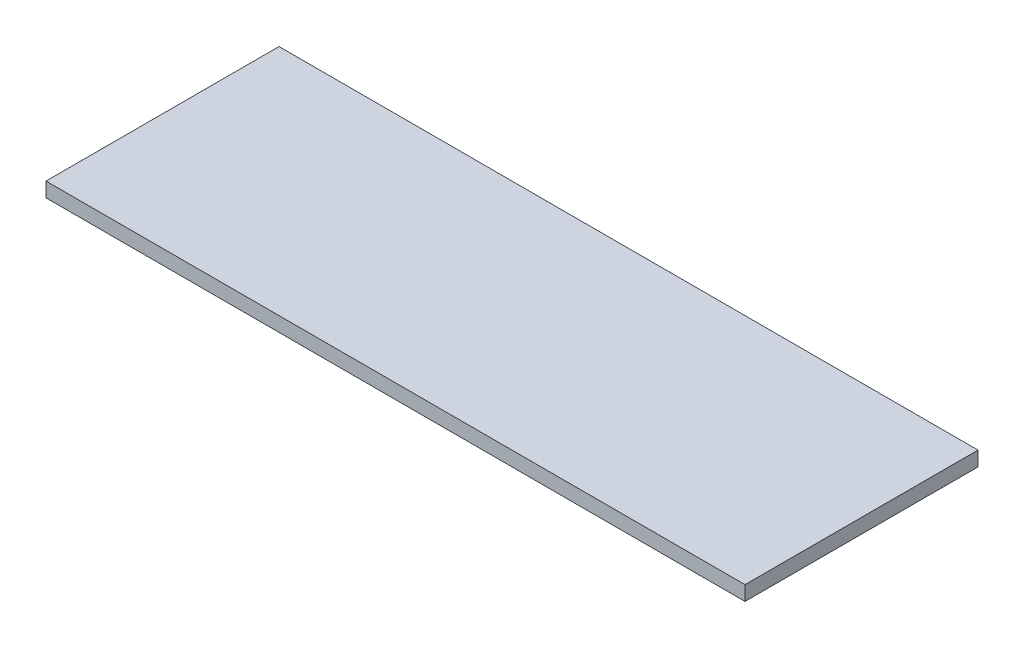
ISO-10303-21;
HEADER;
FILE_DESCRIPTION(('STEP AP214'),'2;1');
FILE_NAME('part.step','',(''),(''),'','','');
FILE_SCHEMA(('AUTOMOTIVE_DESIGN { 1 0 10303 214 1 1 1 1 }'));
ENDSEC;
DATA;
#1=APPLICATION_CONTEXT('core data for automotive mechanical design processes');
#2=APPLICATION_PROTOCOL_DEFINITION('international standard','automotive_design',2000,#1);
#3=PRODUCT_CONTEXT('',#1,'mechanical');
#4=PRODUCT('Part','Part','',(#3));
#5=PRODUCT_RELATED_PRODUCT_CATEGORY('part','',(#4));
#6=PRODUCT_DEFINITION_FORMATION('','',#4);
#7=PRODUCT_DEFINITION_CONTEXT('part definition',#1,'design');
#8=PRODUCT_DEFINITION('design','',#6,#7);
#9=PRODUCT_DEFINITION_SHAPE('','',#8);
#10=(LENGTH_UNIT() NAMED_UNIT(*) SI_UNIT(.MILLI.,.METRE.));
#11=(NAMED_UNIT(*) PLANE_ANGLE_UNIT() SI_UNIT($,.RADIAN.));
#12=(NAMED_UNIT(*) SI_UNIT($,.STERADIAN.) SOLID_ANGLE_UNIT());
#13=UNCERTAINTY_MEASURE_WITH_UNIT(LENGTH_MEASURE(1.E-05),#10,'distance_accuracy_value','');
#14=(GEOMETRIC_REPRESENTATION_CONTEXT(3) GLOBAL_UNCERTAINTY_ASSIGNED_CONTEXT((#13)) GLOBAL_UNIT_ASSIGNED_CONTEXT((#10,
#11,#12)) REPRESENTATION_CONTEXT('',''));
#15=CARTESIAN_POINT('',(0.,0.,0.));
#16=DIRECTION('',(0.,0.,1.));
#17=DIRECTION('',(1.,0.,0.));
#18=AXIS2_PLACEMENT_3D('',#15,#16,#17);
#19=CARTESIAN_POINT('',(19.6888888888889,7.35555555555552,8.25));
#20=DIRECTION('',(1.,0.,0.));
#21=DIRECTION('',(0.,0.,1.));
#22=AXIS2_PLACEMENT_3D('',#19,#20,#21);
#23=PLANE('',#22);
#24=DIRECTION('',(0.,0.,-1.));
#25=VECTOR('',#24,1.);
#26=CARTESIAN_POINT('',(19.6888888888889,8.35555555555552,8.25));
#27=LINE('',#26,#25);
#28=CARTESIAN_POINT('',(19.6888888888889,8.35555555555552,8.25));
#29=VERTEX_POINT('',#28);
#30=CARTESIAN_POINT('',(19.6888888888889,8.35555555555558,-7.75));
#31=VERTEX_POINT('',#30);
#32=EDGE_CURVE('E98',#29,#31,#27,.T.);
#33=ORIENTED_EDGE('',*,*,#32,.T.);
#34=DIRECTION('',(0.,1.,0.));
#35=VECTOR('',#34,1.);
#36=CARTESIAN_POINT('',(19.6888888888889,7.35555555555558,-7.75));
#37=LINE('',#36,#35);
#38=CARTESIAN_POINT('',(19.6888888888889,7.35555555555558,-7.75));
#39=VERTEX_POINT('',#38);
#40=EDGE_CURVE('E11',#39,#31,#37,.T.);
#41=ORIENTED_EDGE('',*,*,#40,.F.);
#42=DIRECTION('',(0.,0.,-1.));
#43=VECTOR('',#42,1.);
#44=CARTESIAN_POINT('',(19.6888888888889,7.35555555555552,8.25));
#45=LINE('',#44,#43);
#46=CARTESIAN_POINT('',(19.6888888888889,7.35555555555552,8.25));
#47=VERTEX_POINT('',#46);
#48=EDGE_CURVE('E86',#47,#39,#45,.T.);
#49=ORIENTED_EDGE('',*,*,#48,.F.);
#50=DIRECTION('',(0.,1.,0.));
#51=VECTOR('',#50,1.);
#52=CARTESIAN_POINT('',(19.6888888888889,7.35555555555552,8.25));
#53=LINE('',#52,#51);
#54=EDGE_CURVE('E94',#47,#29,#53,.T.);
#55=ORIENTED_EDGE('',*,*,#54,.T.);
#56=EDGE_LOOP('',(#33,#41,#49,#55));
#57=FACE_BOUND('',#56,.T.);
#58=ADVANCED_FACE('F35',(#57),#23,.F.);
#59=CARTESIAN_POINT('',(19.6888888888889,7.35555555555558,-7.75));
#60=DIRECTION('',(0.,0.,1.));
#61=DIRECTION('',(0.,-1.,0.));
#62=AXIS2_PLACEMENT_3D('',#59,#60,#61);
#63=PLANE('',#62);
#64=DIRECTION('',(1.,0.,0.));
#65=VECTOR('',#64,1.);
#66=CARTESIAN_POINT('',(19.6888888888889,8.35555555555558,-7.75));
#67=LINE('',#66,#65);
#68=CARTESIAN_POINT('',(67.6888888888889,8.35555555555558,-7.75));
#69=VERTEX_POINT('',#68);
#70=EDGE_CURVE('E90',#31,#69,#67,.T.);
#71=ORIENTED_EDGE('',*,*,#70,.T.);
#72=DIRECTION('',(0.,1.,0.));
#73=VECTOR('',#72,1.);
#74=CARTESIAN_POINT('',(67.6888888888889,7.35555555555558,-7.75));
#75=LINE('',#74,#73);
#76=CARTESIAN_POINT('',(67.6888888888889,7.35555555555558,-7.75));
#77=VERTEX_POINT('',#76);
#78=EDGE_CURVE('E43',#77,#69,#75,.T.);
#79=ORIENTED_EDGE('',*,*,#78,.F.);
#80=DIRECTION('',(1.,0.,0.));
#81=VECTOR('',#80,1.);
#82=CARTESIAN_POINT('',(19.6888888888889,7.35555555555558,-7.75));
#83=LINE('',#82,#81);
#84=EDGE_CURVE('E81',#39,#77,#83,.T.);
#85=ORIENTED_EDGE('',*,*,#84,.F.);
#86=ORIENTED_EDGE('',*,*,#40,.T.);
#87=EDGE_LOOP('',(#71,#79,#85,#86));
#88=FACE_BOUND('',#87,.T.);
#89=ADVANCED_FACE('F89',(#88),#63,.F.);
#90=CARTESIAN_POINT('',(67.6888888888889,7.35555555555552,8.25));
#91=DIRECTION('',(-1.,0.,0.));
#92=DIRECTION('',(0.,0.,-1.));
#93=AXIS2_PLACEMENT_3D('',#90,#91,#92);
#94=PLANE('',#93);
#95=DIRECTION('',(0.,0.,1.));
#96=VECTOR('',#95,1.);
#97=CARTESIAN_POINT('',(67.6888888888889,8.35555555555552,8.25));
#98=LINE('',#97,#96);
#99=CARTESIAN_POINT('',(67.6888888888889,8.35555555555552,8.25));
#100=VERTEX_POINT('',#99);
#101=EDGE_CURVE('E68',#69,#100,#98,.T.);
#102=ORIENTED_EDGE('',*,*,#101,.T.);
#103=DIRECTION('',(0.,1.,0.));
#104=VECTOR('',#103,1.);
#105=CARTESIAN_POINT('',(67.6888888888889,7.35555555555552,8.25));
#106=LINE('',#105,#104);
#107=CARTESIAN_POINT('',(67.6888888888889,7.35555555555552,8.25));
#108=VERTEX_POINT('',#107);
#109=EDGE_CURVE('E91',#108,#100,#106,.T.);
#110=ORIENTED_EDGE('',*,*,#109,.F.);
#111=DIRECTION('',(0.,0.,1.));
#112=VECTOR('',#111,1.);
#113=CARTESIAN_POINT('',(67.6888888888889,7.35555555555552,8.25));
#114=LINE('',#113,#112);
#115=EDGE_CURVE('E84',#77,#108,#114,.T.);
#116=ORIENTED_EDGE('',*,*,#115,.F.);
#117=ORIENTED_EDGE('',*,*,#78,.T.);
#118=EDGE_LOOP('',(#102,#110,#116,#117));
#119=FACE_BOUND('',#118,.T.);
#120=ADVANCED_FACE('F92',(#119),#94,.F.);
#121=CARTESIAN_POINT('',(19.6888888888889,7.35555555555552,8.25));
#122=DIRECTION('',(0.,0.,-1.));
#123=DIRECTION('',(0.,1.,0.));
#124=AXIS2_PLACEMENT_3D('',#121,#122,#123);
#125=PLANE('',#124);
#126=DIRECTION('',(-1.,0.,0.));
#127=VECTOR('',#126,1.);
#128=CARTESIAN_POINT('',(19.6888888888889,8.35555555555552,8.25));
#129=LINE('',#128,#127);
#130=EDGE_CURVE('E74',#100,#29,#129,.T.);
#131=ORIENTED_EDGE('',*,*,#130,.T.);
#132=ORIENTED_EDGE('',*,*,#54,.F.);
#133=DIRECTION('',(-1.,0.,0.));
#134=VECTOR('',#133,1.);
#135=CARTESIAN_POINT('',(19.6888888888889,7.35555555555552,8.25));
#136=LINE('',#135,#134);
#137=EDGE_CURVE('E51',#108,#47,#136,.T.);
#138=ORIENTED_EDGE('',*,*,#137,.F.);
#139=ORIENTED_EDGE('',*,*,#109,.T.);
#140=EDGE_LOOP('',(#131,#132,#138,#139));
#141=FACE_BOUND('',#140,.T.);
#142=ADVANCED_FACE('F105',(#141),#125,.F.);
#143=CARTESIAN_POINT('',(0.,7.35555555555558,-7.85555555555555));
#144=DIRECTION('',(0.,-1.,0.));
#145=DIRECTION('',(1.,0.,0.));
#146=AXIS2_PLACEMENT_3D('',#143,#144,#145);
#147=PLANE('',#146);
#148=ORIENTED_EDGE('',*,*,#48,.T.);
#149=ORIENTED_EDGE('',*,*,#84,.T.);
#150=ORIENTED_EDGE('',*,*,#115,.T.);
#151=ORIENTED_EDGE('',*,*,#137,.T.);
#152=EDGE_LOOP('',(#148,#149,#150,#151));
#153=FACE_BOUND('',#152,.T.);
#154=ADVANCED_FACE('F82',(#153),#147,.T.);
#155=CARTESIAN_POINT('',(0.,8.35555555555558,-7.85555555555555));
#156=DIRECTION('',(0.,-1.,0.));
#157=DIRECTION('',(1.,0.,0.));
#158=AXIS2_PLACEMENT_3D('',#155,#156,#157);
#159=PLANE('',#158);
#160=ORIENTED_EDGE('',*,*,#32,.F.);
#161=ORIENTED_EDGE('',*,*,#130,.F.);
#162=ORIENTED_EDGE('',*,*,#101,.F.);
#163=ORIENTED_EDGE('',*,*,#70,.F.);
#164=EDGE_LOOP('',(#160,#161,#162,#163));
#165=FACE_BOUND('',#164,.T.);
#166=ADVANCED_FACE('F108',(#165),#159,.F.);
#167=CLOSED_SHELL('',(#58,#89,#120,#142,#154,#166));
#168=MANIFOLD_SOLID_BREP('B2',#167);
#169=ADVANCED_BREP_SHAPE_REPRESENTATION('',(#18,#168),#14);
#170=SHAPE_DEFINITION_REPRESENTATION(#9,#169);
ENDSEC;
END-ISO-10303-21;
